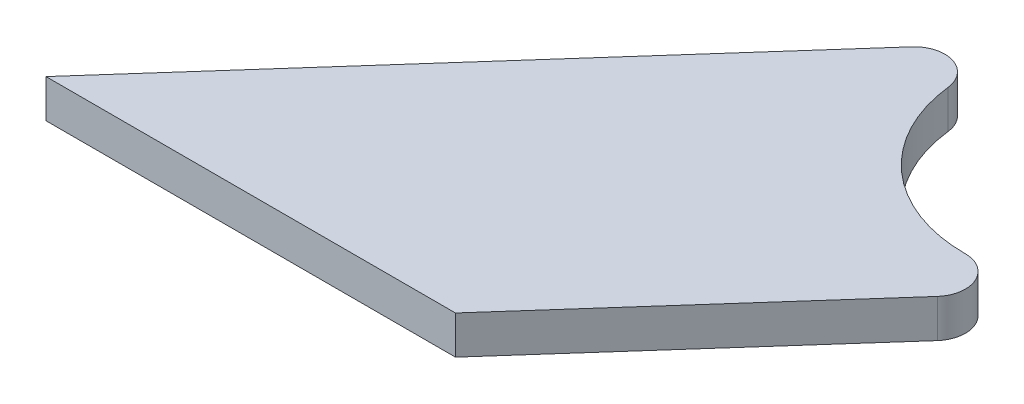
ISO-10303-21;
HEADER;
FILE_DESCRIPTION(('STEP AP214'),'2;1');
FILE_NAME('part.step','',(''),(''),'','','');
FILE_SCHEMA(('AUTOMOTIVE_DESIGN { 1 0 10303 214 1 1 1 1 }'));
ENDSEC;
DATA;
#1=APPLICATION_CONTEXT('core data for automotive mechanical design processes');
#2=APPLICATION_PROTOCOL_DEFINITION('international standard','automotive_design',2000,#1);
#3=PRODUCT_CONTEXT('',#1,'mechanical');
#4=PRODUCT('Part','Part','',(#3));
#5=PRODUCT_RELATED_PRODUCT_CATEGORY('part','',(#4));
#6=PRODUCT_DEFINITION_FORMATION('','',#4);
#7=PRODUCT_DEFINITION_CONTEXT('part definition',#1,'design');
#8=PRODUCT_DEFINITION('design','',#6,#7);
#9=PRODUCT_DEFINITION_SHAPE('','',#8);
#10=(LENGTH_UNIT() NAMED_UNIT(*) SI_UNIT(.MILLI.,.METRE.));
#11=(NAMED_UNIT(*) PLANE_ANGLE_UNIT() SI_UNIT($,.RADIAN.));
#12=(NAMED_UNIT(*) SI_UNIT($,.STERADIAN.) SOLID_ANGLE_UNIT());
#13=UNCERTAINTY_MEASURE_WITH_UNIT(LENGTH_MEASURE(1.E-05),#10,'distance_accuracy_value','');
#14=(GEOMETRIC_REPRESENTATION_CONTEXT(3) GLOBAL_UNCERTAINTY_ASSIGNED_CONTEXT((#13)) GLOBAL_UNIT_ASSIGNED_CONTEXT((#10,
#11,#12)) REPRESENTATION_CONTEXT('',''));
#15=CARTESIAN_POINT('',(0.,0.,0.));
#16=DIRECTION('',(0.,0.,1.));
#17=DIRECTION('',(1.,0.,0.));
#18=AXIS2_PLACEMENT_3D('',#15,#16,#17);
#19=CARTESIAN_POINT('',(-9.49804473600313,3.175,-8.43072631467084));
#20=DIRECTION('',(0.747877538267963,0.,0.663836717690617));
#21=DIRECTION('',(0.663836717690617,0.,-0.747877538267963));
#22=AXIS2_PLACEMENT_3D('',#19,#20,#21);
#23=PLANE('',#22);
#24=DIRECTION('',(-0.663836717690617,0.,0.747877538267963));
#25=VECTOR('',#24,1.);
#26=CARTESIAN_POINT('',(-9.49804473600313,3.175,-8.43072631467084));
#27=LINE('',#26,#25);
#28=CARTESIAN_POINT('',(-17.0387155917232,3.175,0.0645831585439766));
#29=VERTEX_POINT('',#28);
#30=CARTESIAN_POINT('',(-50.8,3.175,38.1));
#31=VERTEX_POINT('',#30);
#32=EDGE_CURVE('E94',#29,#31,#27,.T.);
#33=ORIENTED_EDGE('',*,*,#32,.F.);
#34=DIRECTION('',(0.,-1.,0.));
#35=VECTOR('',#34,1.);
#36=CARTESIAN_POINT('',(-17.0387155917232,3.175,0.0645831585439818));
#37=LINE('',#36,#35);
#38=CARTESIAN_POINT('',(-17.0387155917232,0.,0.0645831585439766));
#39=VERTEX_POINT('',#38);
#40=EDGE_CURVE('E114',#29,#39,#37,.T.);
#41=ORIENTED_EDGE('',*,*,#40,.T.);
#42=DIRECTION('',(-0.663836717690617,0.,0.747877538267963));
#43=VECTOR('',#42,1.);
#44=CARTESIAN_POINT('',(-9.49804473600313,0.,-8.43072631467084));
#45=LINE('',#44,#43);
#46=CARTESIAN_POINT('',(-50.8,0.,38.1));
#47=VERTEX_POINT('',#46);
#48=EDGE_CURVE('E110',#39,#47,#45,.T.);
#49=ORIENTED_EDGE('',*,*,#48,.T.);
#50=DIRECTION('',(0.,-1.,0.));
#51=VECTOR('',#50,1.);
#52=CARTESIAN_POINT('',(-50.8,3.175,38.1));
#53=LINE('',#52,#51);
#54=EDGE_CURVE('E108',#31,#47,#53,.T.);
#55=ORIENTED_EDGE('',*,*,#54,.F.);
#56=EDGE_LOOP('',(#33,#41,#49,#55));
#57=FACE_BOUND('',#56,.T.);
#58=ADVANCED_FACE('F39',(#57),#23,.F.);
#59=CARTESIAN_POINT('',(-50.8,3.175,38.1));
#60=DIRECTION('',(0.,0.,-1.));
#61=DIRECTION('',(-1.,0.,0.));
#62=AXIS2_PLACEMENT_3D('',#59,#60,#61);
#63=PLANE('',#62);
#64=DIRECTION('',(1.,0.,0.));
#65=VECTOR('',#64,1.);
#66=CARTESIAN_POINT('',(-50.8,0.,38.1));
#67=LINE('',#66,#65);
#68=CARTESIAN_POINT('',(-16.8372203999805,0.,38.1));
#69=VERTEX_POINT('',#68);
#70=EDGE_CURVE('E128',#47,#69,#67,.T.);
#71=ORIENTED_EDGE('',*,*,#70,.T.);
#72=DIRECTION('',(0.,-1.,0.));
#73=VECTOR('',#72,1.);
#74=CARTESIAN_POINT('',(-16.8372203999805,3.175,38.1));
#75=LINE('',#74,#73);
#76=CARTESIAN_POINT('',(-16.8372203999805,3.175,38.1));
#77=VERTEX_POINT('',#76);
#78=EDGE_CURVE('E115',#77,#69,#75,.T.);
#79=ORIENTED_EDGE('',*,*,#78,.F.);
#80=DIRECTION('',(1.,0.,0.));
#81=VECTOR('',#80,1.);
#82=CARTESIAN_POINT('',(-50.8,3.175,38.1));
#83=LINE('',#82,#81);
#84=EDGE_CURVE('E98',#31,#77,#83,.T.);
#85=ORIENTED_EDGE('',*,*,#84,.F.);
#86=ORIENTED_EDGE('',*,*,#54,.T.);
#87=EDGE_LOOP('',(#71,#79,#85,#86));
#88=FACE_BOUND('',#87,.T.);
#89=ADVANCED_FACE('F117',(#88),#63,.F.);
#90=CARTESIAN_POINT('',(-16.8372203999805,3.175,38.1));
#91=DIRECTION('',(-0.747877538267963,0.,-0.663836717690617));
#92=DIRECTION('',(-0.663836717690617,0.,0.747877538267963));
#93=AXIS2_PLACEMENT_3D('',#90,#91,#92);
#94=PLANE('',#93);
#95=DIRECTION('',(0.663836717690617,0.,-0.747877538267963));
#96=VECTOR('',#95,1.);
#97=CARTESIAN_POINT('',(-16.8372203999805,0.,38.1));
#98=LINE('',#97,#96);
#99=CARTESIAN_POINT('',(1.95737388028301,0.,16.9260357878857));
#100=VERTEX_POINT('',#99);
#101=EDGE_CURVE('E105',#69,#100,#98,.T.);
#102=ORIENTED_EDGE('',*,*,#101,.T.);
#103=DIRECTION('',(0.,-1.,0.));
#104=VECTOR('',#103,1.);
#105=CARTESIAN_POINT('',(1.95737388028301,3.175,16.9260357878857));
#106=LINE('',#105,#104);
#107=CARTESIAN_POINT('',(1.95737388028301,3.175,16.9260357878857));
#108=VERTEX_POINT('',#107);
#109=EDGE_CURVE('E11',#100,#108,#106,.F.);
#110=ORIENTED_EDGE('',*,*,#109,.T.);
#111=DIRECTION('',(0.663836717690617,0.,-0.747877538267963));
#112=VECTOR('',#111,1.);
#113=CARTESIAN_POINT('',(-16.8372203999805,3.175,38.1));
#114=LINE('',#113,#112);
#115=EDGE_CURVE('E120',#77,#108,#114,.T.);
#116=ORIENTED_EDGE('',*,*,#115,.F.);
#117=ORIENTED_EDGE('',*,*,#78,.T.);
#118=EDGE_LOOP('',(#102,#110,#116,#117));
#119=FACE_BOUND('',#118,.T.);
#120=ADVANCED_FACE('F164',(#119),#94,.F.);
#121=CARTESIAN_POINT('',(0.,3.175,0.));
#122=DIRECTION('',(0.,1.,0.));
#123=DIRECTION('',(0.,0.,1.));
#124=AXIS2_PLACEMENT_3D('',#121,#122,#123);
#125=PLANE('',#124);
#126=CARTESIAN_POINT('',(0.,3.175,0.));
#127=DIRECTION('',(0.,-1.,0.));
#128=DIRECTION('',(0.,0.,-1.));
#129=AXIS2_PLACEMENT_3D('',#126,#127,#128);
#130=CIRCLE('',#129,12.7);
#131=CARTESIAN_POINT('',(0.0481374442353229,3.175,12.6999087707929));
#132=VERTEX_POINT('',#131);
#133=CARTESIAN_POINT('',(-12.6159222037688,3.175,1.45894035123179));
#134=VERTEX_POINT('',#133);
#135=EDGE_CURVE('E129',#132,#134,#130,.T.);
#136=ORIENTED_EDGE('',*,*,#135,.T.);
#137=CARTESIAN_POINT('',(-15.1391066445226,3.175,1.75072842147815));
#138=DIRECTION('',(0.,1.,0.));
#139=DIRECTION('',(0.,0.,1.));
#140=AXIS2_PLACEMENT_3D('',#137,#138,#139);
#141=CIRCLE('',#140,2.54);
#142=EDGE_CURVE('E48',#134,#29,#141,.T.);
#143=ORIENTED_EDGE('',*,*,#142,.T.);
#144=ORIENTED_EDGE('',*,*,#32,.T.);
#145=ORIENTED_EDGE('',*,*,#84,.T.);
#146=ORIENTED_EDGE('',*,*,#115,.T.);
#147=CARTESIAN_POINT('',(0.0577649330823875,3.175,15.2398905249515));
#148=DIRECTION('',(0.,1.,0.));
#149=DIRECTION('',(0.,0.,1.));
#150=AXIS2_PLACEMENT_3D('',#147,#148,#149);
#151=CIRCLE('',#150,2.54);
#152=EDGE_CURVE('E150',#108,#132,#151,.T.);
#153=ORIENTED_EDGE('',*,*,#152,.T.);
#154=EDGE_LOOP('',(#136,#143,#144,#145,#146,#153));
#155=FACE_BOUND('',#154,.T.);
#156=ADVANCED_FACE('F96',(#155),#125,.T.);
#157=CARTESIAN_POINT('',(0.,0.,0.));
#158=DIRECTION('',(0.,1.,0.));
#159=DIRECTION('',(0.,0.,1.));
#160=AXIS2_PLACEMENT_3D('',#157,#158,#159);
#161=PLANE('',#160);
#162=ORIENTED_EDGE('',*,*,#48,.F.);
#163=CARTESIAN_POINT('',(-15.1391066445226,0.,1.75072842147815));
#164=DIRECTION('',(0.,1.,0.));
#165=DIRECTION('',(0.,0.,1.));
#166=AXIS2_PLACEMENT_3D('',#163,#164,#165);
#167=CIRCLE('',#166,2.54);
#168=CARTESIAN_POINT('',(-12.6159222037688,0.,1.45894035123179));
#169=VERTEX_POINT('',#168);
#170=EDGE_CURVE('E141',#39,#169,#167,.F.);
#171=ORIENTED_EDGE('',*,*,#170,.T.);
#172=CARTESIAN_POINT('',(0.,0.,0.));
#173=DIRECTION('',(0.,-1.,0.));
#174=DIRECTION('',(0.,0.,-1.));
#175=AXIS2_PLACEMENT_3D('',#172,#173,#174);
#176=CIRCLE('',#175,12.7);
#177=CARTESIAN_POINT('',(0.0481374442353229,0.,12.6999087707929));
#178=VERTEX_POINT('',#177);
#179=EDGE_CURVE('E159',#178,#169,#176,.T.);
#180=ORIENTED_EDGE('',*,*,#179,.F.);
#181=CARTESIAN_POINT('',(0.0577649330823875,0.,15.2398905249515));
#182=DIRECTION('',(0.,1.,0.));
#183=DIRECTION('',(0.,0.,1.));
#184=AXIS2_PLACEMENT_3D('',#181,#182,#183);
#185=CIRCLE('',#184,2.54);
#186=EDGE_CURVE('E138',#178,#100,#185,.F.);
#187=ORIENTED_EDGE('',*,*,#186,.T.);
#188=ORIENTED_EDGE('',*,*,#101,.F.);
#189=ORIENTED_EDGE('',*,*,#70,.F.);
#190=EDGE_LOOP('',(#162,#171,#180,#187,#188,#189));
#191=FACE_BOUND('',#190,.T.);
#192=ADVANCED_FACE('F163',(#191),#161,.F.);
#193=CARTESIAN_POINT('',(0.,3.175,0.));
#194=DIRECTION('',(0.,-1.,0.));
#195=DIRECTION('',(0.,0.,-1.));
#196=AXIS2_PLACEMENT_3D('',#193,#194,#195);
#197=CYLINDRICAL_SURFACE('',#196,12.7);
#198=ORIENTED_EDGE('',*,*,#179,.T.);
#199=DIRECTION('',(0.,-1.,0.));
#200=VECTOR('',#199,1.);
#201=CARTESIAN_POINT('',(-12.6159222037688,3.175,1.45894035123179));
#202=LINE('',#201,#200);
#203=EDGE_CURVE('E61',#169,#134,#202,.F.);
#204=ORIENTED_EDGE('',*,*,#203,.T.);
#205=ORIENTED_EDGE('',*,*,#135,.F.);
#206=DIRECTION('',(0.,-1.,0.));
#207=VECTOR('',#206,1.);
#208=CARTESIAN_POINT('',(0.0481374442353229,3.175,12.6999087707929));
#209=LINE('',#208,#207);
#210=EDGE_CURVE('E144',#132,#178,#209,.T.);
#211=ORIENTED_EDGE('',*,*,#210,.T.);
#212=EDGE_LOOP('',(#198,#204,#205,#211));
#213=FACE_BOUND('',#212,.T.);
#214=ADVANCED_FACE('F156',(#213),#197,.F.);
#215=CARTESIAN_POINT('',(-15.1391066445226,3.175,1.75072842147815));
#216=DIRECTION('',(0.,-1.,0.));
#217=DIRECTION('',(0.,0.,-1.));
#218=AXIS2_PLACEMENT_3D('',#215,#216,#217);
#219=CYLINDRICAL_SURFACE('',#218,2.54);
#220=ORIENTED_EDGE('',*,*,#142,.F.);
#221=ORIENTED_EDGE('',*,*,#203,.F.);
#222=ORIENTED_EDGE('',*,*,#170,.F.);
#223=ORIENTED_EDGE('',*,*,#40,.F.);
#224=EDGE_LOOP('',(#220,#221,#222,#223));
#225=FACE_BOUND('',#224,.T.);
#226=ADVANCED_FACE('F178',(#225),#219,.T.);
#227=CARTESIAN_POINT('',(0.0577649330823875,3.175,15.2398905249515));
#228=DIRECTION('',(0.,-1.,0.));
#229=DIRECTION('',(0.,0.,-1.));
#230=AXIS2_PLACEMENT_3D('',#227,#228,#229);
#231=CYLINDRICAL_SURFACE('',#230,2.54);
#232=ORIENTED_EDGE('',*,*,#152,.F.);
#233=ORIENTED_EDGE('',*,*,#109,.F.);
#234=ORIENTED_EDGE('',*,*,#186,.F.);
#235=ORIENTED_EDGE('',*,*,#210,.F.);
#236=EDGE_LOOP('',(#232,#233,#234,#235));
#237=FACE_BOUND('',#236,.T.);
#238=ADVANCED_FACE('F41',(#237),#231,.T.);
#239=CLOSED_SHELL('',(#58,#89,#120,#156,#192,#214,#226,#238));
#240=MANIFOLD_SOLID_BREP('B2',#239);
#241=ADVANCED_BREP_SHAPE_REPRESENTATION('',(#18,#240),#14);
#242=SHAPE_DEFINITION_REPRESENTATION(#9,#241);
ENDSEC;
END-ISO-10303-21;
